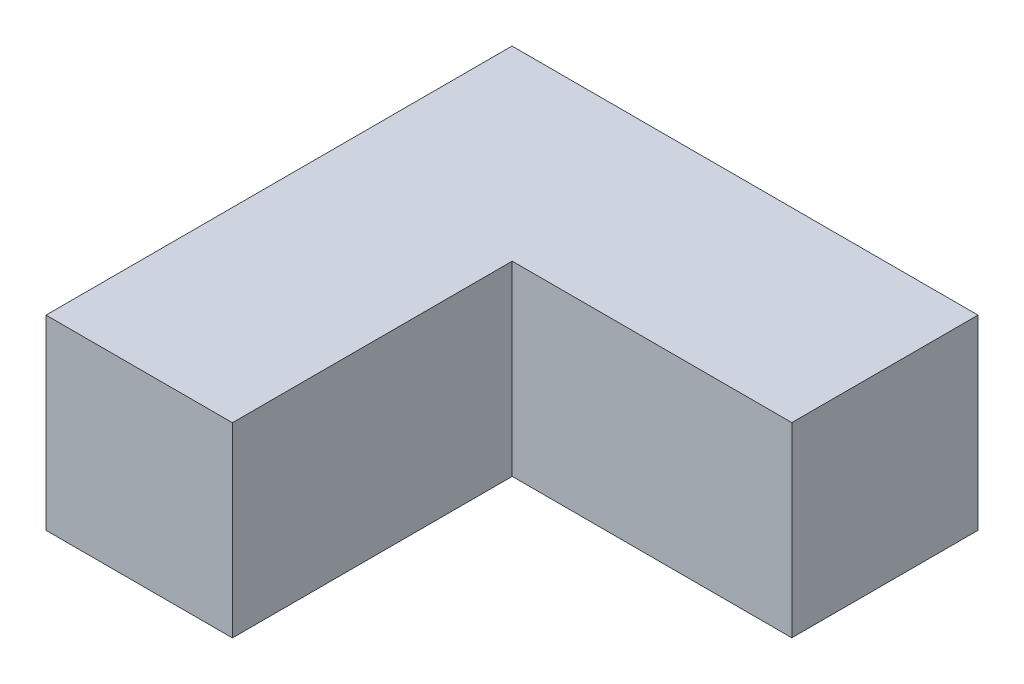
ISO-10303-21;
HEADER;
FILE_DESCRIPTION(('STEP AP214'),'2;1');
FILE_NAME('part.step','',(''),(''),'','','');
FILE_SCHEMA(('AUTOMOTIVE_DESIGN { 1 0 10303 214 1 1 1 1 }'));
ENDSEC;
DATA;
#1=APPLICATION_CONTEXT('core data for automotive mechanical design processes');
#2=APPLICATION_PROTOCOL_DEFINITION('international standard','automotive_design',2000,#1);
#3=PRODUCT_CONTEXT('',#1,'mechanical');
#4=PRODUCT('Part','Part','',(#3));
#5=PRODUCT_RELATED_PRODUCT_CATEGORY('part','',(#4));
#6=PRODUCT_DEFINITION_FORMATION('','',#4);
#7=PRODUCT_DEFINITION_CONTEXT('part definition',#1,'design');
#8=PRODUCT_DEFINITION('design','',#6,#7);
#9=PRODUCT_DEFINITION_SHAPE('','',#8);
#10=(LENGTH_UNIT() NAMED_UNIT(*) SI_UNIT(.MILLI.,.METRE.));
#11=(NAMED_UNIT(*) PLANE_ANGLE_UNIT() SI_UNIT($,.RADIAN.));
#12=(NAMED_UNIT(*) SI_UNIT($,.STERADIAN.) SOLID_ANGLE_UNIT());
#13=UNCERTAINTY_MEASURE_WITH_UNIT(LENGTH_MEASURE(1.E-05),#10,'distance_accuracy_value','');
#14=(GEOMETRIC_REPRESENTATION_CONTEXT(3) GLOBAL_UNCERTAINTY_ASSIGNED_CONTEXT((#13)) GLOBAL_UNIT_ASSIGNED_CONTEXT((#10,
#11,#12)) REPRESENTATION_CONTEXT('',''));
#15=CARTESIAN_POINT('',(0.,0.,0.));
#16=DIRECTION('',(0.,0.,1.));
#17=DIRECTION('',(1.,0.,0.));
#18=AXIS2_PLACEMENT_3D('',#15,#16,#17);
#19=CARTESIAN_POINT('',(2.,0.32089552238806,2.45522388059702));
#20=DIRECTION('',(0.,0.,-1.));
#21=DIRECTION('',(0.,1.,0.));
#22=AXIS2_PLACEMENT_3D('',#19,#20,#21);
#23=PLANE('',#22);
#24=DIRECTION('',(0.,-1.,0.));
#25=VECTOR('',#24,1.);
#26=CARTESIAN_POINT('',(0.,0.32089552238806,2.45522388059702));
#27=LINE('',#26,#25);
#28=CARTESIAN_POINT('',(0.,0.32089552238806,2.45522388059702));
#29=VERTEX_POINT('',#28);
#30=CARTESIAN_POINT('',(0.,-1.67910447761194,2.45522388059702));
#31=VERTEX_POINT('',#30);
#32=EDGE_CURVE('E89',#29,#31,#27,.T.);
#33=ORIENTED_EDGE('',*,*,#32,.T.);
#34=DIRECTION('',(-1.,0.,0.));
#35=VECTOR('',#34,1.);
#36=CARTESIAN_POINT('',(2.,-1.67910447761194,2.45522388059702));
#37=LINE('',#36,#35);
#38=CARTESIAN_POINT('',(2.,-1.67910447761194,2.45522388059702));
#39=VERTEX_POINT('',#38);
#40=EDGE_CURVE('E11',#39,#31,#37,.T.);
#41=ORIENTED_EDGE('',*,*,#40,.F.);
#42=DIRECTION('',(0.,-1.,0.));
#43=VECTOR('',#42,1.);
#44=CARTESIAN_POINT('',(2.,0.32089552238806,2.45522388059702));
#45=LINE('',#44,#43);
#46=CARTESIAN_POINT('',(2.,0.32089552238806,2.45522388059702));
#47=VERTEX_POINT('',#46);
#48=EDGE_CURVE('E83',#47,#39,#45,.T.);
#49=ORIENTED_EDGE('',*,*,#48,.F.);
#50=DIRECTION('',(-1.,0.,0.));
#51=VECTOR('',#50,1.);
#52=CARTESIAN_POINT('',(2.,0.32089552238806,2.45522388059702));
#53=LINE('',#52,#51);
#54=EDGE_CURVE('E75',#47,#29,#53,.T.);
#55=ORIENTED_EDGE('',*,*,#54,.T.);
#56=EDGE_LOOP('',(#33,#41,#49,#55));
#57=FACE_BOUND('',#56,.T.);
#58=ADVANCED_FACE('F33',(#57),#23,.F.);
#59=CARTESIAN_POINT('',(2.,-1.67910447761194,2.45522388059702));
#60=DIRECTION('',(0.,1.,0.));
#61=DIRECTION('',(0.,0.,1.));
#62=AXIS2_PLACEMENT_3D('',#59,#60,#61);
#63=PLANE('',#62);
#64=DIRECTION('',(0.,0.,-1.));
#65=VECTOR('',#64,1.);
#66=CARTESIAN_POINT('',(0.,-1.67910447761194,2.45522388059702));
#67=LINE('',#66,#65);
#68=CARTESIAN_POINT('',(0.,-1.67910447761194,-2.54477611940298));
#69=VERTEX_POINT('',#68);
#70=EDGE_CURVE('E92',#31,#69,#67,.T.);
#71=ORIENTED_EDGE('',*,*,#70,.T.);
#72=DIRECTION('',(-1.,0.,0.));
#73=VECTOR('',#72,1.);
#74=CARTESIAN_POINT('',(2.,-1.67910447761194,-2.54477611940298));
#75=LINE('',#74,#73);
#76=CARTESIAN_POINT('',(5.,-1.67910447761194,-2.54477611940298));
#77=VERTEX_POINT('',#76);
#78=EDGE_CURVE('E40',#77,#69,#75,.T.);
#79=ORIENTED_EDGE('',*,*,#78,.F.);
#80=DIRECTION('',(0.,0.,-1.));
#81=VECTOR('',#80,1.);
#82=CARTESIAN_POINT('',(5.,-1.67910447761194,-2.54477611940298));
#83=LINE('',#82,#81);
#84=CARTESIAN_POINT('',(5.,-1.67910447761194,-0.547070411068407));
#85=VERTEX_POINT('',#84);
#86=EDGE_CURVE('E116',#85,#77,#83,.T.);
#87=ORIENTED_EDGE('',*,*,#86,.F.);
#88=DIRECTION('',(-1.,0.,0.));
#89=VECTOR('',#88,1.);
#90=CARTESIAN_POINT('',(5.,-1.67910447761194,-0.547070411068407));
#91=LINE('',#90,#89);
#92=CARTESIAN_POINT('',(2.,-1.67910447761194,-0.547070411068407));
#93=VERTEX_POINT('',#92);
#94=EDGE_CURVE('E97',#85,#93,#91,.T.);
#95=ORIENTED_EDGE('',*,*,#94,.T.);
#96=DIRECTION('',(0.,0.,-1.));
#97=VECTOR('',#96,1.);
#98=CARTESIAN_POINT('',(2.,-1.67910447761194,2.45522388059702));
#99=LINE('',#98,#97);
#100=EDGE_CURVE('E133',#39,#93,#99,.T.);
#101=ORIENTED_EDGE('',*,*,#100,.F.);
#102=ORIENTED_EDGE('',*,*,#40,.T.);
#103=EDGE_LOOP('',(#71,#79,#87,#95,#101,#102));
#104=FACE_BOUND('',#103,.T.);
#105=ADVANCED_FACE('F113',(#104),#63,.F.);
#106=CARTESIAN_POINT('',(2.,0.32089552238806,-2.54477611940298));
#107=DIRECTION('',(0.,0.,1.));
#108=DIRECTION('',(0.,-1.,0.));
#109=AXIS2_PLACEMENT_3D('',#106,#107,#108);
#110=PLANE('',#109);
#111=DIRECTION('',(0.,1.,0.));
#112=VECTOR('',#111,1.);
#113=CARTESIAN_POINT('',(0.,0.32089552238806,-2.54477611940298));
#114=LINE('',#113,#112);
#115=CARTESIAN_POINT('',(0.,0.32089552238806,-2.54477611940298));
#116=VERTEX_POINT('',#115);
#117=EDGE_CURVE('E84',#69,#116,#114,.T.);
#118=ORIENTED_EDGE('',*,*,#117,.T.);
#119=DIRECTION('',(-1.,0.,0.));
#120=VECTOR('',#119,1.);
#121=CARTESIAN_POINT('',(2.,0.32089552238806,-2.54477611940298));
#122=LINE('',#121,#120);
#123=CARTESIAN_POINT('',(5.,0.32089552238806,-2.54477611940298));
#124=VERTEX_POINT('',#123);
#125=EDGE_CURVE('E79',#124,#116,#122,.T.);
#126=ORIENTED_EDGE('',*,*,#125,.F.);
#127=DIRECTION('',(0.,1.,0.));
#128=VECTOR('',#127,1.);
#129=CARTESIAN_POINT('',(5.,0.32089552238806,-2.54477611940298));
#130=LINE('',#129,#128);
#131=EDGE_CURVE('E109',#77,#124,#130,.T.);
#132=ORIENTED_EDGE('',*,*,#131,.F.);
#133=ORIENTED_EDGE('',*,*,#78,.T.);
#134=EDGE_LOOP('',(#118,#126,#132,#133));
#135=FACE_BOUND('',#134,.T.);
#136=ADVANCED_FACE('F107',(#135),#110,.F.);
#137=CARTESIAN_POINT('',(2.,0.32089552238806,2.45522388059702));
#138=DIRECTION('',(0.,-1.,0.));
#139=DIRECTION('',(0.,0.,-1.));
#140=AXIS2_PLACEMENT_3D('',#137,#138,#139);
#141=PLANE('',#140);
#142=DIRECTION('',(0.,0.,1.));
#143=VECTOR('',#142,1.);
#144=CARTESIAN_POINT('',(0.,0.32089552238806,2.45522388059702));
#145=LINE('',#144,#143);
#146=EDGE_CURVE('E72',#116,#29,#145,.T.);
#147=ORIENTED_EDGE('',*,*,#146,.T.);
#148=ORIENTED_EDGE('',*,*,#54,.F.);
#149=DIRECTION('',(0.,0.,1.));
#150=VECTOR('',#149,1.);
#151=CARTESIAN_POINT('',(2.,0.32089552238806,2.45522388059702));
#152=LINE('',#151,#150);
#153=CARTESIAN_POINT('',(2.,0.32089552238806,-0.547070411068407));
#154=VERTEX_POINT('',#153);
#155=EDGE_CURVE('E52',#154,#47,#152,.T.);
#156=ORIENTED_EDGE('',*,*,#155,.F.);
#157=DIRECTION('',(-1.,0.,0.));
#158=VECTOR('',#157,1.);
#159=CARTESIAN_POINT('',(5.,0.32089552238806,-0.547070411068407));
#160=LINE('',#159,#158);
#161=CARTESIAN_POINT('',(5.,0.32089552238806,-0.547070411068407));
#162=VERTEX_POINT('',#161);
#163=EDGE_CURVE('E93',#162,#154,#160,.T.);
#164=ORIENTED_EDGE('',*,*,#163,.F.);
#165=DIRECTION('',(0.,0.,1.));
#166=VECTOR('',#165,1.);
#167=CARTESIAN_POINT('',(5.,0.32089552238806,-2.54477611940298));
#168=LINE('',#167,#166);
#169=EDGE_CURVE('E128',#124,#162,#168,.T.);
#170=ORIENTED_EDGE('',*,*,#169,.F.);
#171=ORIENTED_EDGE('',*,*,#125,.T.);
#172=EDGE_LOOP('',(#147,#148,#156,#164,#170,#171));
#173=FACE_BOUND('',#172,.T.);
#174=ADVANCED_FACE('F74',(#173),#141,.F.);
#175=CARTESIAN_POINT('',(2.,0.,0.));
#176=DIRECTION('',(1.,0.,0.));
#177=DIRECTION('',(0.,0.,-1.));
#178=AXIS2_PLACEMENT_3D('',#175,#176,#177);
#179=PLANE('',#178);
#180=DIRECTION('',(0.,-1.,0.));
#181=VECTOR('',#180,1.);
#182=CARTESIAN_POINT('',(2.,0.32089552238806,-0.547070411068407));
#183=LINE('',#182,#181);
#184=EDGE_CURVE('E47',#154,#93,#183,.T.);
#185=ORIENTED_EDGE('',*,*,#184,.F.);
#186=ORIENTED_EDGE('',*,*,#155,.T.);
#187=ORIENTED_EDGE('',*,*,#48,.T.);
#188=ORIENTED_EDGE('',*,*,#100,.T.);
#189=EDGE_LOOP('',(#185,#186,#187,#188));
#190=FACE_BOUND('',#189,.T.);
#191=ADVANCED_FACE('F135',(#190),#179,.T.);
#192=CARTESIAN_POINT('',(0.,0.,0.));
#193=DIRECTION('',(1.,0.,0.));
#194=DIRECTION('',(0.,0.,-1.));
#195=AXIS2_PLACEMENT_3D('',#192,#193,#194);
#196=PLANE('',#195);
#197=ORIENTED_EDGE('',*,*,#32,.F.);
#198=ORIENTED_EDGE('',*,*,#146,.F.);
#199=ORIENTED_EDGE('',*,*,#117,.F.);
#200=ORIENTED_EDGE('',*,*,#70,.F.);
#201=EDGE_LOOP('',(#197,#198,#199,#200));
#202=FACE_BOUND('',#201,.T.);
#203=ADVANCED_FACE('F91',(#202),#196,.F.);
#204=CARTESIAN_POINT('',(5.,0.32089552238806,-0.547070411068407));
#205=DIRECTION('',(0.,0.,-1.));
#206=DIRECTION('',(-1.,0.,0.));
#207=AXIS2_PLACEMENT_3D('',#204,#205,#206);
#208=PLANE('',#207);
#209=ORIENTED_EDGE('',*,*,#184,.T.);
#210=ORIENTED_EDGE('',*,*,#94,.F.);
#211=DIRECTION('',(0.,-1.,0.));
#212=VECTOR('',#211,1.);
#213=CARTESIAN_POINT('',(5.,0.32089552238806,-0.547070411068407));
#214=LINE('',#213,#212);
#215=EDGE_CURVE('E124',#162,#85,#214,.T.);
#216=ORIENTED_EDGE('',*,*,#215,.F.);
#217=ORIENTED_EDGE('',*,*,#163,.T.);
#218=EDGE_LOOP('',(#209,#210,#216,#217));
#219=FACE_BOUND('',#218,.T.);
#220=ADVANCED_FACE('F137',(#219),#208,.F.);
#221=CARTESIAN_POINT('',(5.,0.,0.));
#222=DIRECTION('',(-1.,0.,0.));
#223=DIRECTION('',(0.,0.,1.));
#224=AXIS2_PLACEMENT_3D('',#221,#222,#223);
#225=PLANE('',#224);
#226=ORIENTED_EDGE('',*,*,#131,.T.);
#227=ORIENTED_EDGE('',*,*,#169,.T.);
#228=ORIENTED_EDGE('',*,*,#215,.T.);
#229=ORIENTED_EDGE('',*,*,#86,.T.);
#230=EDGE_LOOP('',(#226,#227,#228,#229));
#231=FACE_BOUND('',#230,.T.);
#232=ADVANCED_FACE('F120',(#231),#225,.F.);
#233=CLOSED_SHELL('',(#58,#105,#136,#174,#191,#203,#220,#232));
#234=MANIFOLD_SOLID_BREP('B2',#233);
#235=ADVANCED_BREP_SHAPE_REPRESENTATION('',(#18,#234),#14);
#236=SHAPE_DEFINITION_REPRESENTATION(#9,#235);
ENDSEC;
END-ISO-10303-21;
